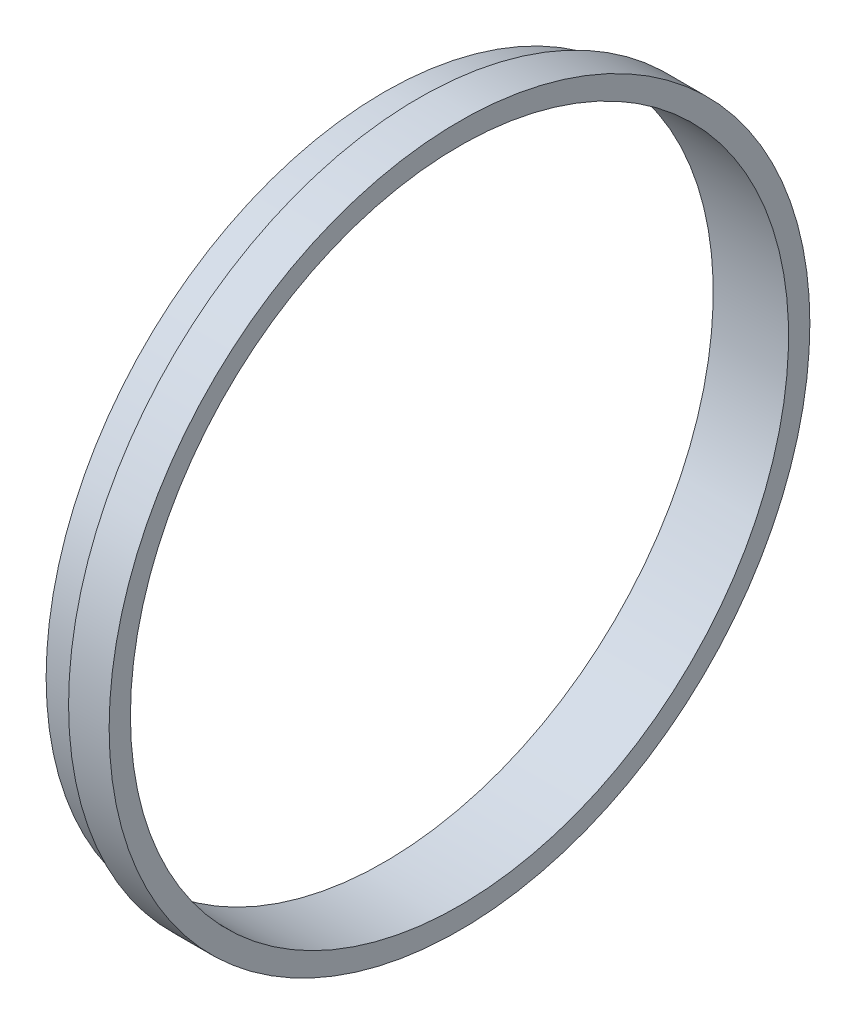
ISO-10303-21;
HEADER;
FILE_DESCRIPTION(('STEP AP214'),'2;1');
FILE_NAME('part.step','',(''),(''),'','','');
FILE_SCHEMA(('AUTOMOTIVE_DESIGN { 1 0 10303 214 1 1 1 1 }'));
ENDSEC;
DATA;
#1=APPLICATION_CONTEXT('core data for automotive mechanical design processes');
#2=APPLICATION_PROTOCOL_DEFINITION('international standard','automotive_design',2000,#1);
#3=PRODUCT_CONTEXT('',#1,'mechanical');
#4=PRODUCT('Part','Part','',(#3));
#5=PRODUCT_RELATED_PRODUCT_CATEGORY('part','',(#4));
#6=PRODUCT_DEFINITION_FORMATION('','',#4);
#7=PRODUCT_DEFINITION_CONTEXT('part definition',#1,'design');
#8=PRODUCT_DEFINITION('design','',#6,#7);
#9=PRODUCT_DEFINITION_SHAPE('','',#8);
#10=(LENGTH_UNIT() NAMED_UNIT(*) SI_UNIT(.MILLI.,.METRE.));
#11=(NAMED_UNIT(*) PLANE_ANGLE_UNIT() SI_UNIT($,.RADIAN.));
#12=(NAMED_UNIT(*) SI_UNIT($,.STERADIAN.) SOLID_ANGLE_UNIT());
#13=UNCERTAINTY_MEASURE_WITH_UNIT(LENGTH_MEASURE(1.E-05),#10,'distance_accuracy_value','');
#14=(GEOMETRIC_REPRESENTATION_CONTEXT(3) GLOBAL_UNCERTAINTY_ASSIGNED_CONTEXT((#13)) GLOBAL_UNIT_ASSIGNED_CONTEXT((#10,
#11,#12)) REPRESENTATION_CONTEXT('',''));
#15=CARTESIAN_POINT('',(0.,0.,0.));
#16=DIRECTION('',(0.,0.,1.));
#17=DIRECTION('',(1.,0.,0.));
#18=AXIS2_PLACEMENT_3D('',#15,#16,#17);
#19=CARTESIAN_POINT('',(0.,149.176985009,0.));
#20=DIRECTION('',(1.,0.,0.));
#21=DIRECTION('',(0.,0.,-1.));
#22=AXIS2_PLACEMENT_3D('',#19,#20,#21);
#23=PLANE('',#22);
#24=CARTESIAN_POINT('',(0.,0.,0.));
#25=DIRECTION('',(-1.,0.,0.));
#26=DIRECTION('',(0.,0.,1.));
#27=AXIS2_PLACEMENT_3D('',#24,#25,#26);
#28=CIRCLE('',#27,145.226985009);
#29=CARTESIAN_POINT('',(0.,0.,145.226985009));
#30=VERTEX_POINT('',#29);
#31=EDGE_CURVE('E10',#30,#30,#28,.T.);
#32=ORIENTED_EDGE('',*,*,#31,.F.);
#33=EDGE_LOOP('',(#32));
#34=FACE_BOUND('',#33,.T.);
#35=CARTESIAN_POINT('',(0.,0.,0.));
#36=DIRECTION('',(-1.,0.,0.));
#37=DIRECTION('',(0.,0.,1.));
#38=AXIS2_PLACEMENT_3D('',#35,#36,#37);
#39=CIRCLE('',#38,149.176985009);
#40=CARTESIAN_POINT('',(0.,0.,149.176985009));
#41=VERTEX_POINT('',#40);
#42=EDGE_CURVE('E65',#41,#41,#39,.T.);
#43=ORIENTED_EDGE('',*,*,#42,.T.);
#44=EDGE_LOOP('',(#43));
#45=FACE_BOUND('',#44,.T.);
#46=ADVANCED_FACE('F40',(#34,#45),#23,.F.);
#47=CARTESIAN_POINT('',(-72.365,0.,0.));
#48=DIRECTION('',(-1.,0.,0.));
#49=DIRECTION('',(0.,0.,1.));
#50=AXIS2_PLACEMENT_3D('',#47,#48,#49);
#51=CYLINDRICAL_SURFACE('',#50,145.226985009);
#52=CARTESIAN_POINT('',(33.25,0.,0.));
#53=DIRECTION('',(-1.,0.,0.));
#54=DIRECTION('',(0.,0.,1.));
#55=AXIS2_PLACEMENT_3D('',#52,#53,#54);
#56=CIRCLE('',#55,145.226985009);
#57=CARTESIAN_POINT('',(33.25,0.,145.226985009));
#58=VERTEX_POINT('',#57);
#59=EDGE_CURVE('E43',#58,#58,#56,.T.);
#60=ORIENTED_EDGE('',*,*,#59,.F.);
#61=EDGE_LOOP('',(#60));
#62=FACE_BOUND('',#61,.T.);
#63=ORIENTED_EDGE('',*,*,#31,.T.);
#64=EDGE_LOOP('',(#63));
#65=FACE_BOUND('',#64,.T.);
#66=ADVANCED_FACE('F105',(#62,#65),#51,.F.);
#67=CARTESIAN_POINT('',(33.25,145.226985009,0.));
#68=DIRECTION('',(-1.,0.,0.));
#69=DIRECTION('',(0.,0.,1.));
#70=AXIS2_PLACEMENT_3D('',#67,#68,#69);
#71=PLANE('',#70);
#72=CARTESIAN_POINT('',(33.25,0.,0.));
#73=DIRECTION('',(-1.,0.,0.));
#74=DIRECTION('',(0.,0.,1.));
#75=AXIS2_PLACEMENT_3D('',#72,#73,#74);
#76=CIRCLE('',#75,154.626985009);
#77=CARTESIAN_POINT('',(33.25,0.,154.626985009));
#78=VERTEX_POINT('',#77);
#79=EDGE_CURVE('E50',#78,#78,#76,.T.);
#80=ORIENTED_EDGE('',*,*,#79,.F.);
#81=EDGE_LOOP('',(#80));
#82=FACE_BOUND('',#81,.T.);
#83=ORIENTED_EDGE('',*,*,#59,.T.);
#84=EDGE_LOOP('',(#83));
#85=FACE_BOUND('',#84,.T.);
#86=ADVANCED_FACE('F100',(#82,#85),#71,.F.);
#87=CARTESIAN_POINT('',(-72.365,0.,0.));
#88=DIRECTION('',(-1.,0.,0.));
#89=DIRECTION('',(0.,0.,1.));
#90=AXIS2_PLACEMENT_3D('',#87,#88,#89);
#91=CYLINDRICAL_SURFACE('',#90,154.626985009);
#92=CARTESIAN_POINT('',(15.35,0.,0.));
#93=DIRECTION('',(-1.,0.,0.));
#94=DIRECTION('',(0.,0.,1.));
#95=AXIS2_PLACEMENT_3D('',#92,#93,#94);
#96=CIRCLE('',#95,154.626985009);
#97=CARTESIAN_POINT('',(15.35,0.,154.626985009));
#98=VERTEX_POINT('',#97);
#99=EDGE_CURVE('E51',#98,#98,#96,.T.);
#100=ORIENTED_EDGE('',*,*,#99,.F.);
#101=EDGE_LOOP('',(#100));
#102=FACE_BOUND('',#101,.T.);
#103=ORIENTED_EDGE('',*,*,#79,.T.);
#104=EDGE_LOOP('',(#103));
#105=FACE_BOUND('',#104,.T.);
#106=ADVANCED_FACE('F91',(#102,#105),#91,.T.);
#107=CARTESIAN_POINT('',(15.35,154.626985009,0.));
#108=DIRECTION('',(1.,0.,0.));
#109=DIRECTION('',(0.,0.,-1.));
#110=AXIS2_PLACEMENT_3D('',#107,#108,#109);
#111=PLANE('',#110);
#112=CARTESIAN_POINT('',(15.35,0.,0.));
#113=DIRECTION('',(-1.,0.,0.));
#114=DIRECTION('',(0.,0.,1.));
#115=AXIS2_PLACEMENT_3D('',#112,#113,#114);
#116=CIRCLE('',#115,151.901985009);
#117=CARTESIAN_POINT('',(15.35,0.,151.901985009));
#118=VERTEX_POINT('',#117);
#119=EDGE_CURVE('E57',#118,#118,#116,.T.);
#120=ORIENTED_EDGE('',*,*,#119,.F.);
#121=EDGE_LOOP('',(#120));
#122=FACE_BOUND('',#121,.T.);
#123=ORIENTED_EDGE('',*,*,#99,.T.);
#124=EDGE_LOOP('',(#123));
#125=FACE_BOUND('',#124,.T.);
#126=ADVANCED_FACE('F82',(#122,#125),#111,.F.);
#127=CARTESIAN_POINT('',(-72.365,0.,0.));
#128=DIRECTION('',(-1.,0.,0.));
#129=DIRECTION('',(0.,0.,1.));
#130=AXIS2_PLACEMENT_3D('',#127,#128,#129);
#131=CYLINDRICAL_SURFACE('',#130,151.901985009);
#132=CARTESIAN_POINT('',(20.15,0.,0.));
#133=DIRECTION('',(-1.,0.,0.));
#134=DIRECTION('',(0.,0.,1.));
#135=AXIS2_PLACEMENT_3D('',#132,#133,#134);
#136=CIRCLE('',#135,151.901985009);
#137=CARTESIAN_POINT('',(20.15,0.,151.901985009));
#138=VERTEX_POINT('',#137);
#139=EDGE_CURVE('E56',#138,#138,#136,.T.);
#140=ORIENTED_EDGE('',*,*,#139,.F.);
#141=EDGE_LOOP('',(#140));
#142=FACE_BOUND('',#141,.T.);
#143=ORIENTED_EDGE('',*,*,#119,.T.);
#144=EDGE_LOOP('',(#143));
#145=FACE_BOUND('',#144,.T.);
#146=ADVANCED_FACE('F80',(#142,#145),#131,.F.);
#147=CARTESIAN_POINT('',(20.15,151.901985009,0.));
#148=DIRECTION('',(1.,0.,0.));
#149=DIRECTION('',(0.,0.,-1.));
#150=AXIS2_PLACEMENT_3D('',#147,#148,#149);
#151=PLANE('',#150);
#152=CARTESIAN_POINT('',(20.15,0.,0.));
#153=DIRECTION('',(-1.,0.,0.));
#154=DIRECTION('',(0.,0.,1.));
#155=AXIS2_PLACEMENT_3D('',#152,#153,#154);
#156=CIRCLE('',#155,149.176985009);
#157=CARTESIAN_POINT('',(20.15,0.,149.176985009));
#158=VERTEX_POINT('',#157);
#159=EDGE_CURVE('E62',#158,#158,#156,.T.);
#160=ORIENTED_EDGE('',*,*,#159,.F.);
#161=EDGE_LOOP('',(#160));
#162=FACE_BOUND('',#161,.T.);
#163=ORIENTED_EDGE('',*,*,#139,.T.);
#164=EDGE_LOOP('',(#163));
#165=FACE_BOUND('',#164,.T.);
#166=ADVANCED_FACE('F74',(#162,#165),#151,.F.);
#167=CARTESIAN_POINT('',(-72.365,0.,0.));
#168=DIRECTION('',(-1.,0.,0.));
#169=DIRECTION('',(0.,0.,1.));
#170=AXIS2_PLACEMENT_3D('',#167,#168,#169);
#171=CYLINDRICAL_SURFACE('',#170,149.176985009);
#172=ORIENTED_EDGE('',*,*,#42,.F.);
#173=EDGE_LOOP('',(#172));
#174=FACE_BOUND('',#173,.T.);
#175=ORIENTED_EDGE('',*,*,#159,.T.);
#176=EDGE_LOOP('',(#175));
#177=FACE_BOUND('',#176,.T.);
#178=ADVANCED_FACE('F68',(#174,#177),#171,.T.);
#179=CLOSED_SHELL('',(#46,#66,#86,#106,#126,#146,#166,#178));
#180=MANIFOLD_SOLID_BREP('B2',#179);
#181=ADVANCED_BREP_SHAPE_REPRESENTATION('',(#18,#180),#14);
#182=SHAPE_DEFINITION_REPRESENTATION(#9,#181);
ENDSEC;
END-ISO-10303-21;
